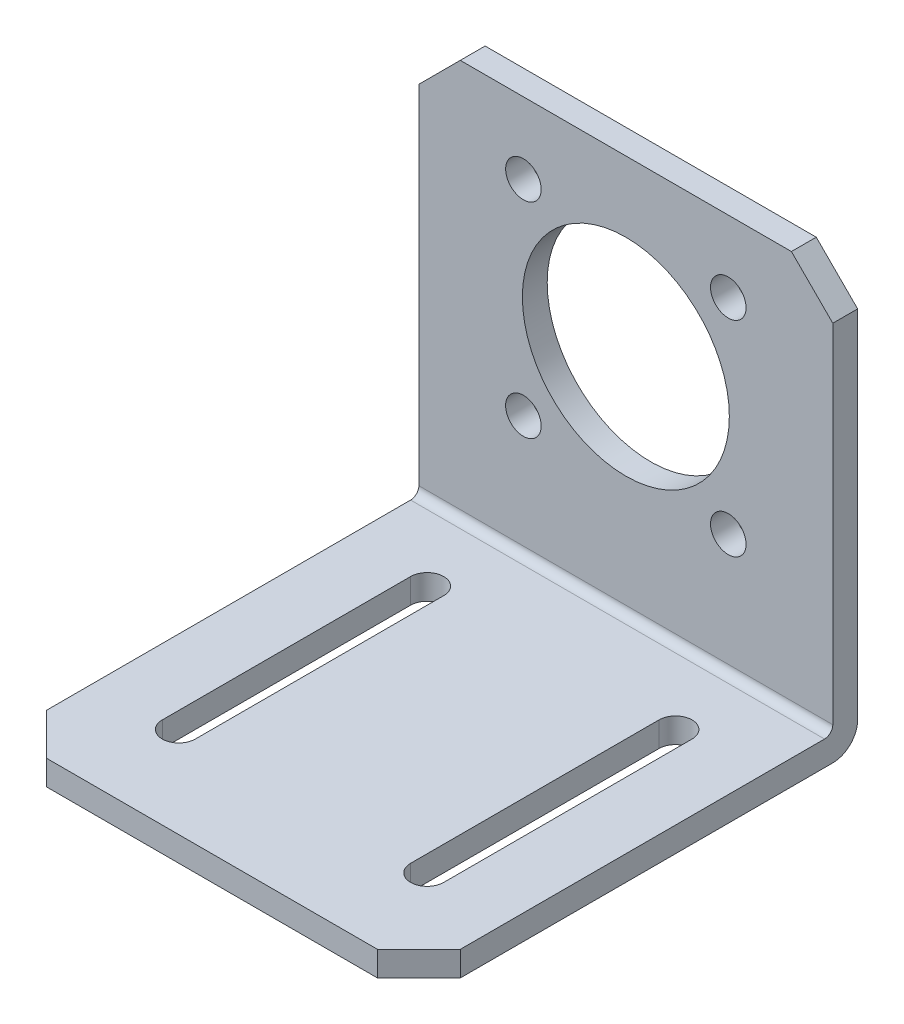
ISO-10303-21;
HEADER;
FILE_DESCRIPTION(('STEP AP214'),'2;1');
FILE_NAME('part.step','',(''),(''),'','','');
FILE_SCHEMA(('AUTOMOTIVE_DESIGN { 1 0 10303 214 1 1 1 1 }'));
ENDSEC;
DATA;
#1=APPLICATION_CONTEXT('core data for automotive mechanical design processes');
#2=APPLICATION_PROTOCOL_DEFINITION('international standard','automotive_design',2000,#1);
#3=PRODUCT_CONTEXT('',#1,'mechanical');
#4=PRODUCT('Part','Part','',(#3));
#5=PRODUCT_RELATED_PRODUCT_CATEGORY('part','',(#4));
#6=PRODUCT_DEFINITION_FORMATION('','',#4);
#7=PRODUCT_DEFINITION_CONTEXT('part definition',#1,'design');
#8=PRODUCT_DEFINITION('design','',#6,#7);
#9=PRODUCT_DEFINITION_SHAPE('','',#8);
#10=(LENGTH_UNIT() NAMED_UNIT(*) SI_UNIT(.MILLI.,.METRE.));
#11=(NAMED_UNIT(*) PLANE_ANGLE_UNIT() SI_UNIT($,.RADIAN.));
#12=(NAMED_UNIT(*) SI_UNIT($,.STERADIAN.) SOLID_ANGLE_UNIT());
#13=UNCERTAINTY_MEASURE_WITH_UNIT(LENGTH_MEASURE(1.E-05),#10,'distance_accuracy_value','');
#14=(GEOMETRIC_REPRESENTATION_CONTEXT(3) GLOBAL_UNCERTAINTY_ASSIGNED_CONTEXT((#13)) GLOBAL_UNIT_ASSIGNED_CONTEXT((#10,
#11,#12)) REPRESENTATION_CONTEXT('',''));
#15=CARTESIAN_POINT('',(0.,0.,0.));
#16=DIRECTION('',(0.,0.,1.));
#17=DIRECTION('',(1.,0.,0.));
#18=AXIS2_PLACEMENT_3D('',#15,#16,#17);
#19=CARTESIAN_POINT('',(50.,-10.3553299492386,18.5685279187817));
#20=DIRECTION('',(0.,0.,-1.));
#21=DIRECTION('',(-1.,0.,0.));
#22=AXIS2_PLACEMENT_3D('',#19,#20,#21);
#23=PLANE('',#22);
#24=DIRECTION('',(-1.,0.,0.));
#25=VECTOR('',#24,1.);
#26=CARTESIAN_POINT('',(50.,-10.3553299492386,18.5685279187817));
#27=LINE('',#26,#25);
#28=CARTESIAN_POINT('',(45.,-10.3553299492386,18.5685279187817));
#29=VERTEX_POINT('',#28);
#30=CARTESIAN_POINT('',(4.99999999999999,-10.3553299492386,18.5685279187817));
#31=VERTEX_POINT('',#30);
#32=EDGE_CURVE('E321',#29,#31,#27,.T.);
#33=ORIENTED_EDGE('',*,*,#32,.F.);
#34=DIRECTION('',(0.,1.,0.));
#35=VECTOR('',#34,1.);
#36=CARTESIAN_POINT('',(45.,-7.35532994923857,18.5685279187817));
#37=LINE('',#36,#35);
#38=CARTESIAN_POINT('',(45.,-7.35532994923857,18.5685279187817));
#39=VERTEX_POINT('',#38);
#40=EDGE_CURVE('E343',#29,#39,#37,.T.);
#41=ORIENTED_EDGE('',*,*,#40,.T.);
#42=DIRECTION('',(-1.,0.,0.));
#43=VECTOR('',#42,1.);
#44=CARTESIAN_POINT('',(50.,-7.35532994923857,18.5685279187817));
#45=LINE('',#44,#43);
#46=CARTESIAN_POINT('',(4.99999999999999,-7.35532994923857,18.5685279187817));
#47=VERTEX_POINT('',#46);
#48=EDGE_CURVE('E284',#39,#47,#45,.T.);
#49=ORIENTED_EDGE('',*,*,#48,.T.);
#50=DIRECTION('',(0.,-1.,0.));
#51=VECTOR('',#50,1.);
#52=CARTESIAN_POINT('',(4.99999999999999,-10.3553299492386,18.5685279187817));
#53=LINE('',#52,#51);
#54=EDGE_CURVE('E339',#47,#31,#53,.T.);
#55=ORIENTED_EDGE('',*,*,#54,.T.);
#56=EDGE_LOOP('',(#33,#41,#49,#55));
#57=FACE_BOUND('',#56,.T.);
#58=ADVANCED_FACE('F41',(#57),#23,.F.);
#59=CARTESIAN_POINT('',(50.,-10.3553299492386,18.5685279187817));
#60=DIRECTION('',(0.,1.,0.));
#61=DIRECTION('',(0.,0.,1.));
#62=AXIS2_PLACEMENT_3D('',#59,#60,#61);
#63=PLANE('',#62);
#64=DIRECTION('',(0.,0.,-1.));
#65=VECTOR('',#64,1.);
#66=CARTESIAN_POINT('',(8.,-10.3553299492386,7.5685279187817));
#67=LINE('',#66,#65);
#68=CARTESIAN_POINT('',(8.,-10.3553299492386,7.5685279187817));
#69=VERTEX_POINT('',#68);
#70=CARTESIAN_POINT('',(8.,-10.3553299492386,-22.4314720812183));
#71=VERTEX_POINT('',#70);
#72=EDGE_CURVE('E197',#69,#71,#67,.T.);
#73=ORIENTED_EDGE('',*,*,#72,.F.);
#74=CARTESIAN_POINT('',(10.,-10.3553299492386,7.5685279187817));
#75=DIRECTION('',(0.,-1.,0.));
#76=DIRECTION('',(0.,0.,-1.));
#77=AXIS2_PLACEMENT_3D('',#74,#75,#76);
#78=CIRCLE('',#77,2.);
#79=CARTESIAN_POINT('',(12.,-10.3553299492386,7.5685279187817));
#80=VERTEX_POINT('',#79);
#81=EDGE_CURVE('E57',#80,#69,#78,.T.);
#82=ORIENTED_EDGE('',*,*,#81,.F.);
#83=DIRECTION('',(0.,0.,1.));
#84=VECTOR('',#83,1.);
#85=CARTESIAN_POINT('',(12.,-10.3553299492386,7.5685279187817));
#86=LINE('',#85,#84);
#87=CARTESIAN_POINT('',(12.,-10.3553299492386,-22.4314720812183));
#88=VERTEX_POINT('',#87);
#89=EDGE_CURVE('E205',#88,#80,#86,.T.);
#90=ORIENTED_EDGE('',*,*,#89,.F.);
#91=CARTESIAN_POINT('',(10.,-10.3553299492386,-22.4314720812183));
#92=DIRECTION('',(0.,-1.,0.));
#93=DIRECTION('',(0.,0.,-1.));
#94=AXIS2_PLACEMENT_3D('',#91,#92,#93);
#95=CIRCLE('',#94,2.);
#96=EDGE_CURVE('E186',#71,#88,#95,.T.);
#97=ORIENTED_EDGE('',*,*,#96,.F.);
#98=EDGE_LOOP('',(#73,#82,#90,#97));
#99=FACE_BOUND('',#98,.T.);
#100=DIRECTION('',(0.,0.,-1.));
#101=VECTOR('',#100,1.);
#102=CARTESIAN_POINT('',(38.,-10.3553299492386,7.5685279187817));
#103=LINE('',#102,#101);
#104=CARTESIAN_POINT('',(38.,-10.3553299492386,7.5685279187817));
#105=VERTEX_POINT('',#104);
#106=CARTESIAN_POINT('',(38.,-10.3553299492386,-22.4314720812183));
#107=VERTEX_POINT('',#106);
#108=EDGE_CURVE('E222',#105,#107,#103,.T.);
#109=ORIENTED_EDGE('',*,*,#108,.F.);
#110=CARTESIAN_POINT('',(40.,-10.3553299492386,7.5685279187817));
#111=DIRECTION('',(0.,-1.,0.));
#112=DIRECTION('',(0.,0.,-1.));
#113=AXIS2_PLACEMENT_3D('',#110,#111,#112);
#114=CIRCLE('',#113,2.);
#115=CARTESIAN_POINT('',(42.,-10.3553299492386,7.5685279187817));
#116=VERTEX_POINT('',#115);
#117=EDGE_CURVE('E65',#116,#105,#114,.T.);
#118=ORIENTED_EDGE('',*,*,#117,.F.);
#119=DIRECTION('',(0.,0.,1.));
#120=VECTOR('',#119,1.);
#121=CARTESIAN_POINT('',(42.,-10.3553299492386,7.5685279187817));
#122=LINE('',#121,#120);
#123=CARTESIAN_POINT('',(42.,-10.3553299492386,-22.4314720812183));
#124=VERTEX_POINT('',#123);
#125=EDGE_CURVE('E230',#124,#116,#122,.T.);
#126=ORIENTED_EDGE('',*,*,#125,.F.);
#127=CARTESIAN_POINT('',(40.,-10.3553299492386,-22.4314720812183));
#128=DIRECTION('',(0.,-1.,0.));
#129=DIRECTION('',(0.,0.,-1.));
#130=AXIS2_PLACEMENT_3D('',#127,#128,#129);
#131=CIRCLE('',#130,2.);
#132=EDGE_CURVE('E226',#107,#124,#131,.T.);
#133=ORIENTED_EDGE('',*,*,#132,.F.);
#134=EDGE_LOOP('',(#109,#118,#126,#133));
#135=FACE_BOUND('',#134,.T.);
#136=DIRECTION('',(0.,0.,-1.));
#137=VECTOR('',#136,1.);
#138=CARTESIAN_POINT('',(50.,-10.3553299492386,18.5685279187817));
#139=LINE('',#138,#137);
#140=CARTESIAN_POINT('',(50.,-10.3553299492386,13.5685279187817));
#141=VERTEX_POINT('',#140);
#142=CARTESIAN_POINT('',(50.,-10.3553299492386,-31.4314720812183));
#143=VERTEX_POINT('',#142);
#144=EDGE_CURVE('E266',#141,#143,#139,.T.);
#145=ORIENTED_EDGE('',*,*,#144,.F.);
#146=DIRECTION('',(-0.707106781186549,0.,0.707106781186547));
#147=VECTOR('',#146,1.);
#148=CARTESIAN_POINT('',(50.,-10.3553299492386,13.5685279187817));
#149=LINE('',#148,#147);
#150=EDGE_CURVE('E336',#141,#29,#149,.T.);
#151=ORIENTED_EDGE('',*,*,#150,.T.);
#152=ORIENTED_EDGE('',*,*,#32,.T.);
#153=DIRECTION('',(0.707106781186547,0.,0.707106781186549));
#154=VECTOR('',#153,1.);
#155=CARTESIAN_POINT('',(4.99999999999999,-10.3553299492386,18.5685279187817));
#156=LINE('',#155,#154);
#157=CARTESIAN_POINT('',(0.,-10.3553299492386,13.5685279187817));
#158=VERTEX_POINT('',#157);
#159=EDGE_CURVE('E333',#31,#158,#156,.F.);
#160=ORIENTED_EDGE('',*,*,#159,.T.);
#161=DIRECTION('',(0.,0.,-1.));
#162=VECTOR('',#161,1.);
#163=CARTESIAN_POINT('',(0.,-10.3553299492386,18.5685279187817));
#164=LINE('',#163,#162);
#165=CARTESIAN_POINT('',(0.,-10.3553299492386,-31.4314720812183));
#166=VERTEX_POINT('',#165);
#167=EDGE_CURVE('E285',#158,#166,#164,.T.);
#168=ORIENTED_EDGE('',*,*,#167,.T.);
#169=DIRECTION('',(-1.,0.,0.));
#170=VECTOR('',#169,1.);
#171=CARTESIAN_POINT('',(50.,-10.3553299492386,-31.4314720812183));
#172=LINE('',#171,#170);
#173=EDGE_CURVE('E317',#143,#166,#172,.T.);
#174=ORIENTED_EDGE('',*,*,#173,.F.);
#175=EDGE_LOOP('',(#145,#151,#152,#160,#168,#174));
#176=FACE_BOUND('',#175,.T.);
#177=ADVANCED_FACE('F202',(#99,#135,#176),#63,.F.);
#178=CARTESIAN_POINT('',(50.,-7.35532994923857,-31.4314720812183));
#179=DIRECTION('',(-1.,0.,0.));
#180=DIRECTION('',(0.,0.,1.));
#181=AXIS2_PLACEMENT_3D('',#178,#179,#180);
#182=CYLINDRICAL_SURFACE('',#181,3.);
#183=CARTESIAN_POINT('',(0.,-7.35532994923857,-31.4314720812183));
#184=DIRECTION('',(1.,0.,0.));
#185=DIRECTION('',(0.,0.,-1.));
#186=AXIS2_PLACEMENT_3D('',#183,#184,#185);
#187=CIRCLE('',#186,3.);
#188=CARTESIAN_POINT('',(0.,-7.35532994923857,-34.4314720812183));
#189=VERTEX_POINT('',#188);
#190=EDGE_CURVE('E288',#166,#189,#187,.T.);
#191=ORIENTED_EDGE('',*,*,#190,.T.);
#192=DIRECTION('',(-1.,0.,0.));
#193=VECTOR('',#192,1.);
#194=CARTESIAN_POINT('',(50.,-7.35532994923857,-34.4314720812183));
#195=LINE('',#194,#193);
#196=CARTESIAN_POINT('',(50.,-7.35532994923857,-34.4314720812183));
#197=VERTEX_POINT('',#196);
#198=EDGE_CURVE('E313',#197,#189,#195,.T.);
#199=ORIENTED_EDGE('',*,*,#198,.F.);
#200=CARTESIAN_POINT('',(50.,-7.35532994923857,-31.4314720812183));
#201=DIRECTION('',(1.,0.,0.));
#202=DIRECTION('',(0.,0.,-1.));
#203=AXIS2_PLACEMENT_3D('',#200,#201,#202);
#204=CIRCLE('',#203,3.);
#205=EDGE_CURVE('E269',#143,#197,#204,.T.);
#206=ORIENTED_EDGE('',*,*,#205,.F.);
#207=ORIENTED_EDGE('',*,*,#173,.T.);
#208=EDGE_LOOP('',(#191,#199,#206,#207));
#209=FACE_BOUND('',#208,.T.);
#210=ADVANCED_FACE('F458',(#209),#182,.T.);
#211=CARTESIAN_POINT('',(50.,-7.35532994923855,-34.4314720812183));
#212=DIRECTION('',(0.,0.,1.));
#213=DIRECTION('',(1.,0.,0.));
#214=AXIS2_PLACEMENT_3D('',#211,#212,#213);
#215=PLANE('',#214);
#216=CARTESIAN_POINT('',(37.3743686707646,7.27030137999685,-34.4314720812183));
#217=DIRECTION('',(0.,0.,-1.));
#218=DIRECTION('',(1.,0.,0.));
#219=AXIS2_PLACEMENT_3D('',#216,#217,#218);
#220=CIRCLE('',#219,2.14780184113266);
#221=CARTESIAN_POINT('',(39.5221705118972,7.27030137999685,-34.4314720812183));
#222=VERTEX_POINT('',#221);
#223=EDGE_CURVE('E215',#222,#222,#220,.T.);
#224=ORIENTED_EDGE('',*,*,#223,.F.);
#225=EDGE_LOOP('',(#224));
#226=FACE_BOUND('',#225,.T.);
#227=CARTESIAN_POINT('',(12.6256313292354,7.27030137999685,-34.4314720812183));
#228=DIRECTION('',(0.,0.,-1.));
#229=DIRECTION('',(-1.,0.,0.));
#230=AXIS2_PLACEMENT_3D('',#227,#228,#229);
#231=CIRCLE('',#230,2.14780184113266);
#232=CARTESIAN_POINT('',(10.4778294881028,7.27030137999685,-34.4314720812183));
#233=VERTEX_POINT('',#232);
#234=EDGE_CURVE('E255',#233,#233,#231,.T.);
#235=ORIENTED_EDGE('',*,*,#234,.F.);
#236=EDGE_LOOP('',(#235));
#237=FACE_BOUND('',#236,.T.);
#238=CARTESIAN_POINT('',(12.6256313292354,32.019038721526,-34.4314720812183));
#239=DIRECTION('',(0.,0.,-1.));
#240=DIRECTION('',(1.,0.,0.));
#241=AXIS2_PLACEMENT_3D('',#238,#239,#240);
#242=CIRCLE('',#241,2.14780184113266);
#243=CARTESIAN_POINT('',(14.7734331703681,32.019038721526,-34.4314720812183));
#244=VERTEX_POINT('',#243);
#245=EDGE_CURVE('E251',#244,#244,#242,.T.);
#246=ORIENTED_EDGE('',*,*,#245,.F.);
#247=EDGE_LOOP('',(#246));
#248=FACE_BOUND('',#247,.T.);
#249=CARTESIAN_POINT('',(37.3743686707646,32.019038721526,-34.4314720812183));
#250=DIRECTION('',(0.,0.,-1.));
#251=DIRECTION('',(-1.,0.,0.));
#252=AXIS2_PLACEMENT_3D('',#249,#250,#251);
#253=CIRCLE('',#252,2.14780184113266);
#254=CARTESIAN_POINT('',(35.2265668296319,32.019038721526,-34.4314720812183));
#255=VERTEX_POINT('',#254);
#256=EDGE_CURVE('E246',#255,#255,#253,.T.);
#257=ORIENTED_EDGE('',*,*,#256,.F.);
#258=EDGE_LOOP('',(#257));
#259=FACE_BOUND('',#258,.T.);
#260=CARTESIAN_POINT('',(25.,19.6446700507614,-34.4314720812183));
#261=DIRECTION('',(0.,0.,-1.));
#262=DIRECTION('',(-1.,0.,0.));
#263=AXIS2_PLACEMENT_3D('',#260,#261,#262);
#264=CIRCLE('',#263,12.5);
#265=CARTESIAN_POINT('',(12.5,19.6446700507614,-34.4314720812183));
#266=VERTEX_POINT('',#265);
#267=EDGE_CURVE('E250',#266,#266,#264,.T.);
#268=ORIENTED_EDGE('',*,*,#267,.F.);
#269=EDGE_LOOP('',(#268));
#270=FACE_BOUND('',#269,.T.);
#271=DIRECTION('',(0.,1.,0.));
#272=VECTOR('',#271,1.);
#273=CARTESIAN_POINT('',(0.,-7.35532994923855,-34.4314720812183));
#274=LINE('',#273,#272);
#275=CARTESIAN_POINT('',(0.,35.6446700507614,-34.4314720812183));
#276=VERTEX_POINT('',#275);
#277=EDGE_CURVE('E292',#189,#276,#274,.T.);
#278=ORIENTED_EDGE('',*,*,#277,.T.);
#279=DIRECTION('',(-0.707106781186547,-0.707106781186548,0.));
#280=VECTOR('',#279,1.);
#281=CARTESIAN_POINT('',(4.99999999999999,40.6446700507614,-34.4314720812183));
#282=LINE('',#281,#280);
#283=CARTESIAN_POINT('',(4.99999999999999,40.6446700507614,-34.4314720812183));
#284=VERTEX_POINT('',#283);
#285=EDGE_CURVE('E376',#276,#284,#282,.F.);
#286=ORIENTED_EDGE('',*,*,#285,.T.);
#287=DIRECTION('',(-1.,0.,0.));
#288=VECTOR('',#287,1.);
#289=CARTESIAN_POINT('',(50.,40.6446700507614,-34.4314720812183));
#290=LINE('',#289,#288);
#291=CARTESIAN_POINT('',(45.,40.6446700507614,-34.4314720812183));
#292=VERTEX_POINT('',#291);
#293=EDGE_CURVE('E309',#292,#284,#290,.T.);
#294=ORIENTED_EDGE('',*,*,#293,.F.);
#295=DIRECTION('',(0.707106781186549,-0.707106781186546,0.));
#296=VECTOR('',#295,1.);
#297=CARTESIAN_POINT('',(50.,35.6446700507614,-34.4314720812183));
#298=LINE('',#297,#296);
#299=CARTESIAN_POINT('',(50.,35.6446700507614,-34.4314720812183));
#300=VERTEX_POINT('',#299);
#301=EDGE_CURVE('E373',#292,#300,#298,.T.);
#302=ORIENTED_EDGE('',*,*,#301,.T.);
#303=DIRECTION('',(0.,1.,0.));
#304=VECTOR('',#303,1.);
#305=CARTESIAN_POINT('',(50.,-7.35532994923855,-34.4314720812183));
#306=LINE('',#305,#304);
#307=EDGE_CURVE('E273',#197,#300,#306,.T.);
#308=ORIENTED_EDGE('',*,*,#307,.F.);
#309=ORIENTED_EDGE('',*,*,#198,.T.);
#310=EDGE_LOOP('',(#278,#286,#294,#302,#308,#309));
#311=FACE_BOUND('',#310,.T.);
#312=ADVANCED_FACE('F501',(#226,#237,#248,#259,#270,#311),#215,.F.);
#313=CARTESIAN_POINT('',(50.,40.6446700507614,-34.4314720812183));
#314=DIRECTION('',(0.,-1.,0.));
#315=DIRECTION('',(0.,0.,-1.));
#316=AXIS2_PLACEMENT_3D('',#313,#314,#315);
#317=PLANE('',#316);
#318=ORIENTED_EDGE('',*,*,#293,.T.);
#319=DIRECTION('',(0.,0.,1.));
#320=VECTOR('',#319,1.);
#321=CARTESIAN_POINT('',(4.99999999999999,40.6446700507614,-34.4314720812183));
#322=LINE('',#321,#320);
#323=CARTESIAN_POINT('',(4.99999999999999,40.6446700507614,-31.4314720812183));
#324=VERTEX_POINT('',#323);
#325=EDGE_CURVE('E363',#284,#324,#322,.T.);
#326=ORIENTED_EDGE('',*,*,#325,.T.);
#327=DIRECTION('',(-1.,0.,0.));
#328=VECTOR('',#327,1.);
#329=CARTESIAN_POINT('',(50.,40.6446700507614,-31.4314720812183));
#330=LINE('',#329,#328);
#331=CARTESIAN_POINT('',(45.,40.6446700507614,-31.4314720812183));
#332=VERTEX_POINT('',#331);
#333=EDGE_CURVE('E305',#332,#324,#330,.T.);
#334=ORIENTED_EDGE('',*,*,#333,.F.);
#335=DIRECTION('',(0.,0.,-1.));
#336=VECTOR('',#335,1.);
#337=CARTESIAN_POINT('',(45.,40.6446700507614,-34.4314720812183));
#338=LINE('',#337,#336);
#339=EDGE_CURVE('E360',#332,#292,#338,.T.);
#340=ORIENTED_EDGE('',*,*,#339,.T.);
#341=EDGE_LOOP('',(#318,#326,#334,#340));
#342=FACE_BOUND('',#341,.T.);
#343=ADVANCED_FACE('F519',(#342),#317,.F.);
#344=CARTESIAN_POINT('',(50.,-7.35532994923857,-31.4314720812183));
#345=DIRECTION('',(0.,0.,-1.));
#346=DIRECTION('',(0.,1.,0.));
#347=AXIS2_PLACEMENT_3D('',#344,#345,#346);
#348=PLANE('',#347);
#349=CARTESIAN_POINT('',(37.3743686707646,7.27030137999685,-31.4314720812183));
#350=DIRECTION('',(0.,0.,-1.));
#351=DIRECTION('',(0.,1.,0.));
#352=AXIS2_PLACEMENT_3D('',#349,#350,#351);
#353=CIRCLE('',#352,2.14780184113266);
#354=CARTESIAN_POINT('',(37.3743686707646,9.41810322112952,-31.4314720812183));
#355=VERTEX_POINT('',#354);
#356=EDGE_CURVE('E289',#355,#355,#353,.T.);
#357=ORIENTED_EDGE('',*,*,#356,.T.);
#358=EDGE_LOOP('',(#357));
#359=FACE_BOUND('',#358,.T.);
#360=CARTESIAN_POINT('',(12.6256313292354,7.27030137999685,-31.4314720812183));
#361=DIRECTION('',(0.,0.,-1.));
#362=DIRECTION('',(0.,1.,0.));
#363=AXIS2_PLACEMENT_3D('',#360,#361,#362);
#364=CIRCLE('',#363,2.14780184113266);
#365=CARTESIAN_POINT('',(12.6256313292354,9.41810322112952,-31.4314720812183));
#366=VERTEX_POINT('',#365);
#367=EDGE_CURVE('E404',#366,#366,#364,.T.);
#368=ORIENTED_EDGE('',*,*,#367,.T.);
#369=EDGE_LOOP('',(#368));
#370=FACE_BOUND('',#369,.T.);
#371=CARTESIAN_POINT('',(12.6256313292354,32.019038721526,-31.4314720812183));
#372=DIRECTION('',(0.,0.,-1.));
#373=DIRECTION('',(0.,1.,0.));
#374=AXIS2_PLACEMENT_3D('',#371,#372,#373);
#375=CIRCLE('',#374,2.14780184113266);
#376=CARTESIAN_POINT('',(12.6256313292354,34.1668405626587,-31.4314720812183));
#377=VERTEX_POINT('',#376);
#378=EDGE_CURVE('E400',#377,#377,#375,.T.);
#379=ORIENTED_EDGE('',*,*,#378,.T.);
#380=EDGE_LOOP('',(#379));
#381=FACE_BOUND('',#380,.T.);
#382=CARTESIAN_POINT('',(37.3743686707646,32.019038721526,-31.4314720812183));
#383=DIRECTION('',(0.,0.,-1.));
#384=DIRECTION('',(0.,1.,0.));
#385=AXIS2_PLACEMENT_3D('',#382,#383,#384);
#386=CIRCLE('',#385,2.14780184113266);
#387=CARTESIAN_POINT('',(37.3743686707646,34.1668405626587,-31.4314720812183));
#388=VERTEX_POINT('',#387);
#389=EDGE_CURVE('E396',#388,#388,#386,.T.);
#390=ORIENTED_EDGE('',*,*,#389,.T.);
#391=EDGE_LOOP('',(#390));
#392=FACE_BOUND('',#391,.T.);
#393=CARTESIAN_POINT('',(25.,19.6446700507614,-31.4314720812183));
#394=DIRECTION('',(0.,0.,-1.));
#395=DIRECTION('',(0.,1.,0.));
#396=AXIS2_PLACEMENT_3D('',#393,#394,#395);
#397=CIRCLE('',#396,12.5);
#398=CARTESIAN_POINT('',(25.,32.1446700507614,-31.4314720812183));
#399=VERTEX_POINT('',#398);
#400=EDGE_CURVE('E265',#399,#399,#397,.T.);
#401=ORIENTED_EDGE('',*,*,#400,.T.);
#402=EDGE_LOOP('',(#401));
#403=FACE_BOUND('',#402,.T.);
#404=DIRECTION('',(0.,-1.,0.));
#405=VECTOR('',#404,1.);
#406=CARTESIAN_POINT('',(0.,-7.35532994923857,-31.4314720812183));
#407=LINE('',#406,#405);
#408=CARTESIAN_POINT('',(0.,35.6446700507614,-31.4314720812183));
#409=VERTEX_POINT('',#408);
#410=CARTESIAN_POINT('',(0.,-6.35532994923857,-31.4314720812183));
#411=VERTEX_POINT('',#410);
#412=EDGE_CURVE('E296',#409,#411,#407,.T.);
#413=ORIENTED_EDGE('',*,*,#412,.T.);
#414=DIRECTION('',(-1.,0.,0.));
#415=VECTOR('',#414,1.);
#416=CARTESIAN_POINT('',(50.,-6.35532994923857,-31.4314720812183));
#417=LINE('',#416,#415);
#418=CARTESIAN_POINT('',(50.,-6.35532994923857,-31.4314720812183));
#419=VERTEX_POINT('',#418);
#420=EDGE_CURVE('E383',#411,#419,#417,.F.);
#421=ORIENTED_EDGE('',*,*,#420,.T.);
#422=DIRECTION('',(0.,-1.,0.));
#423=VECTOR('',#422,1.);
#424=CARTESIAN_POINT('',(50.,-7.35532994923857,-31.4314720812183));
#425=LINE('',#424,#423);
#426=CARTESIAN_POINT('',(50.,35.6446700507614,-31.4314720812183));
#427=VERTEX_POINT('',#426);
#428=EDGE_CURVE('E277',#427,#419,#425,.T.);
#429=ORIENTED_EDGE('',*,*,#428,.F.);
#430=DIRECTION('',(-0.707106781186549,0.707106781186546,0.));
#431=VECTOR('',#430,1.);
#432=CARTESIAN_POINT('',(50.,35.6446700507614,-31.4314720812184));
#433=LINE('',#432,#431);
#434=EDGE_CURVE('E367',#427,#332,#433,.T.);
#435=ORIENTED_EDGE('',*,*,#434,.T.);
#436=ORIENTED_EDGE('',*,*,#333,.T.);
#437=DIRECTION('',(0.707106781186547,0.707106781186548,0.));
#438=VECTOR('',#437,1.);
#439=CARTESIAN_POINT('',(4.99999999999999,40.6446700507614,-31.4314720812183));
#440=LINE('',#439,#438);
#441=EDGE_CURVE('E370',#324,#409,#440,.F.);
#442=ORIENTED_EDGE('',*,*,#441,.T.);
#443=EDGE_LOOP('',(#413,#421,#429,#435,#436,#442));
#444=FACE_BOUND('',#443,.T.);
#445=ADVANCED_FACE('F522',(#359,#370,#381,#392,#403,#444),#348,.F.);
#446=CARTESIAN_POINT('',(50.,-7.35532994923857,18.5685279187817));
#447=DIRECTION('',(0.,-1.,0.));
#448=DIRECTION('',(0.,0.,-1.));
#449=AXIS2_PLACEMENT_3D('',#446,#447,#448);
#450=PLANE('',#449);
#451=DIRECTION('',(0.,0.,1.));
#452=VECTOR('',#451,1.);
#453=CARTESIAN_POINT('',(12.,-7.35532994923857,18.5685279187817));
#454=LINE('',#453,#452);
#455=CARTESIAN_POINT('',(12.,-7.35532994923857,-22.4314720812183));
#456=VERTEX_POINT('',#455);
#457=CARTESIAN_POINT('',(12.,-7.35532994923857,7.5685279187817));
#458=VERTEX_POINT('',#457);
#459=EDGE_CURVE('E50',#456,#458,#454,.T.);
#460=ORIENTED_EDGE('',*,*,#459,.T.);
#461=CARTESIAN_POINT('',(10.,-7.35532994923857,7.5685279187817));
#462=DIRECTION('',(0.,-1.,0.));
#463=DIRECTION('',(0.,0.,-1.));
#464=AXIS2_PLACEMENT_3D('',#461,#462,#463);
#465=CIRCLE('',#464,2.);
#466=CARTESIAN_POINT('',(8.,-7.35532994923857,7.5685279187817));
#467=VERTEX_POINT('',#466);
#468=EDGE_CURVE('E11',#458,#467,#465,.T.);
#469=ORIENTED_EDGE('',*,*,#468,.T.);
#470=DIRECTION('',(0.,0.,-1.));
#471=VECTOR('',#470,1.);
#472=CARTESIAN_POINT('',(8.,-7.35532994923857,18.5685279187817));
#473=LINE('',#472,#471);
#474=CARTESIAN_POINT('',(8.,-7.35532994923857,-22.4314720812183));
#475=VERTEX_POINT('',#474);
#476=EDGE_CURVE('E426',#467,#475,#473,.T.);
#477=ORIENTED_EDGE('',*,*,#476,.T.);
#478=CARTESIAN_POINT('',(10.,-7.35532994923857,-22.4314720812183));
#479=DIRECTION('',(0.,-1.,0.));
#480=DIRECTION('',(0.,0.,-1.));
#481=AXIS2_PLACEMENT_3D('',#478,#479,#480);
#482=CIRCLE('',#481,2.);
#483=EDGE_CURVE('E189',#475,#456,#482,.T.);
#484=ORIENTED_EDGE('',*,*,#483,.T.);
#485=EDGE_LOOP('',(#460,#469,#477,#484));
#486=FACE_BOUND('',#485,.T.);
#487=DIRECTION('',(0.,0.,1.));
#488=VECTOR('',#487,1.);
#489=CARTESIAN_POINT('',(42.,-7.35532994923857,18.5685279187817));
#490=LINE('',#489,#488);
#491=CARTESIAN_POINT('',(42.,-7.35532994923857,-22.4314720812183));
#492=VERTEX_POINT('',#491);
#493=CARTESIAN_POINT('',(42.,-7.35532994923857,7.5685279187817));
#494=VERTEX_POINT('',#493);
#495=EDGE_CURVE('E418',#492,#494,#490,.T.);
#496=ORIENTED_EDGE('',*,*,#495,.T.);
#497=CARTESIAN_POINT('',(40.,-7.35532994923857,7.5685279187817));
#498=DIRECTION('',(0.,-1.,0.));
#499=DIRECTION('',(0.,0.,-1.));
#500=AXIS2_PLACEMENT_3D('',#497,#498,#499);
#501=CIRCLE('',#500,2.);
#502=CARTESIAN_POINT('',(38.,-7.35532994923857,7.5685279187817));
#503=VERTEX_POINT('',#502);
#504=EDGE_CURVE('E422',#494,#503,#501,.T.);
#505=ORIENTED_EDGE('',*,*,#504,.T.);
#506=DIRECTION('',(0.,0.,-1.));
#507=VECTOR('',#506,1.);
#508=CARTESIAN_POINT('',(38.,-7.35532994923857,18.5685279187817));
#509=LINE('',#508,#507);
#510=CARTESIAN_POINT('',(38.,-7.35532994923857,-22.4314720812183));
#511=VERTEX_POINT('',#510);
#512=EDGE_CURVE('E392',#503,#511,#509,.T.);
#513=ORIENTED_EDGE('',*,*,#512,.T.);
#514=CARTESIAN_POINT('',(40.,-7.35532994923857,-22.4314720812183));
#515=DIRECTION('',(0.,-1.,0.));
#516=DIRECTION('',(0.,0.,-1.));
#517=AXIS2_PLACEMENT_3D('',#514,#515,#516);
#518=CIRCLE('',#517,2.);
#519=EDGE_CURVE('E414',#511,#492,#518,.T.);
#520=ORIENTED_EDGE('',*,*,#519,.T.);
#521=EDGE_LOOP('',(#496,#505,#513,#520));
#522=FACE_BOUND('',#521,.T.);
#523=DIRECTION('',(0.,0.,1.));
#524=VECTOR('',#523,1.);
#525=CARTESIAN_POINT('',(50.,-7.35532994923857,18.5685279187817));
#526=LINE('',#525,#524);
#527=CARTESIAN_POINT('',(50.,-7.35532994923857,-30.4314720812183));
#528=VERTEX_POINT('',#527);
#529=CARTESIAN_POINT('',(50.,-7.35532994923857,13.5685279187817));
#530=VERTEX_POINT('',#529);
#531=EDGE_CURVE('E281',#528,#530,#526,.T.);
#532=ORIENTED_EDGE('',*,*,#531,.F.);
#533=DIRECTION('',(-1.,0.,0.));
#534=VECTOR('',#533,1.);
#535=CARTESIAN_POINT('',(0.,-7.35532994923857,-30.4314720812183));
#536=LINE('',#535,#534);
#537=CARTESIAN_POINT('',(0.,-7.35532994923857,-30.4314720812183));
#538=VERTEX_POINT('',#537);
#539=EDGE_CURVE('E379',#528,#538,#536,.T.);
#540=ORIENTED_EDGE('',*,*,#539,.T.);
#541=DIRECTION('',(0.,0.,1.));
#542=VECTOR('',#541,1.);
#543=CARTESIAN_POINT('',(0.,-7.35532994923857,18.5685279187817));
#544=LINE('',#543,#542);
#545=CARTESIAN_POINT('',(0.,-7.35532994923857,13.5685279187817));
#546=VERTEX_POINT('',#545);
#547=EDGE_CURVE('E270',#538,#546,#544,.T.);
#548=ORIENTED_EDGE('',*,*,#547,.T.);
#549=DIRECTION('',(-0.707106781186547,0.,-0.707106781186549));
#550=VECTOR('',#549,1.);
#551=CARTESIAN_POINT('',(4.99999999999999,-7.35532994923857,18.5685279187817));
#552=LINE('',#551,#550);
#553=EDGE_CURVE('E346',#546,#47,#552,.F.);
#554=ORIENTED_EDGE('',*,*,#553,.T.);
#555=ORIENTED_EDGE('',*,*,#48,.F.);
#556=DIRECTION('',(0.707106781186549,0.,-0.707106781186547));
#557=VECTOR('',#556,1.);
#558=CARTESIAN_POINT('',(50.,-7.35532994923857,13.5685279187817));
#559=LINE('',#558,#557);
#560=EDGE_CURVE('E349',#39,#530,#559,.T.);
#561=ORIENTED_EDGE('',*,*,#560,.T.);
#562=EDGE_LOOP('',(#532,#540,#548,#554,#555,#561));
#563=FACE_BOUND('',#562,.T.);
#564=ADVANCED_FACE('F433',(#486,#522,#563),#450,.F.);
#565=CARTESIAN_POINT('',(50.,-7.35532994923857,-31.4314720812183));
#566=DIRECTION('',(1.,0.,0.));
#567=DIRECTION('',(0.,0.,-1.));
#568=AXIS2_PLACEMENT_3D('',#565,#566,#567);
#569=PLANE('',#568);
#570=ORIENTED_EDGE('',*,*,#428,.T.);
#571=CARTESIAN_POINT('',(50.,-6.35532994923857,-30.4314720812183));
#572=DIRECTION('',(1.,0.,0.));
#573=DIRECTION('',(0.,0.,-1.));
#574=AXIS2_PLACEMENT_3D('',#571,#572,#573);
#575=CIRCLE('',#574,1.);
#576=EDGE_CURVE('E389',#419,#528,#575,.F.);
#577=ORIENTED_EDGE('',*,*,#576,.T.);
#578=ORIENTED_EDGE('',*,*,#531,.T.);
#579=DIRECTION('',(0.,-1.,0.));
#580=VECTOR('',#579,1.);
#581=CARTESIAN_POINT('',(50.,-10.3553299492386,13.5685279187817));
#582=LINE('',#581,#580);
#583=EDGE_CURVE('E329',#530,#141,#582,.T.);
#584=ORIENTED_EDGE('',*,*,#583,.T.);
#585=ORIENTED_EDGE('',*,*,#144,.T.);
#586=ORIENTED_EDGE('',*,*,#205,.T.);
#587=ORIENTED_EDGE('',*,*,#307,.T.);
#588=DIRECTION('',(0.,0.,1.));
#589=VECTOR('',#588,1.);
#590=CARTESIAN_POINT('',(50.,35.6446700507614,-31.4314720812183));
#591=LINE('',#590,#589);
#592=EDGE_CURVE('E325',#300,#427,#591,.T.);
#593=ORIENTED_EDGE('',*,*,#592,.T.);
#594=EDGE_LOOP('',(#570,#577,#578,#584,#585,#586,#587,#593));
#595=FACE_BOUND('',#594,.T.);
#596=ADVANCED_FACE('F503',(#595),#569,.T.);
#597=CARTESIAN_POINT('',(0.,-7.35532994923857,-31.4314720812183));
#598=DIRECTION('',(1.,0.,0.));
#599=DIRECTION('',(0.,0.,-1.));
#600=AXIS2_PLACEMENT_3D('',#597,#598,#599);
#601=PLANE('',#600);
#602=ORIENTED_EDGE('',*,*,#167,.F.);
#603=DIRECTION('',(0.,1.,0.));
#604=VECTOR('',#603,1.);
#605=CARTESIAN_POINT('',(0.,-7.35532994923857,13.5685279187817));
#606=LINE('',#605,#604);
#607=EDGE_CURVE('E356',#158,#546,#606,.T.);
#608=ORIENTED_EDGE('',*,*,#607,.T.);
#609=ORIENTED_EDGE('',*,*,#547,.F.);
#610=CARTESIAN_POINT('',(0.,-6.35532994923857,-30.4314720812183));
#611=DIRECTION('',(1.,0.,0.));
#612=DIRECTION('',(0.,0.,-1.));
#613=AXIS2_PLACEMENT_3D('',#610,#611,#612);
#614=CIRCLE('',#613,1.);
#615=EDGE_CURVE('E386',#538,#411,#614,.T.);
#616=ORIENTED_EDGE('',*,*,#615,.T.);
#617=ORIENTED_EDGE('',*,*,#412,.F.);
#618=DIRECTION('',(0.,0.,-1.));
#619=VECTOR('',#618,1.);
#620=CARTESIAN_POINT('',(0.,35.6446700507614,-31.4314720812184));
#621=LINE('',#620,#619);
#622=EDGE_CURVE('E353',#409,#276,#621,.T.);
#623=ORIENTED_EDGE('',*,*,#622,.T.);
#624=ORIENTED_EDGE('',*,*,#277,.F.);
#625=ORIENTED_EDGE('',*,*,#190,.F.);
#626=EDGE_LOOP('',(#602,#608,#609,#616,#617,#623,#624,#625));
#627=FACE_BOUND('',#626,.T.);
#628=ADVANCED_FACE('F471',(#627),#601,.F.);
#629=CARTESIAN_POINT('',(50.,-7.35532994923857,13.5685279187817));
#630=DIRECTION('',(0.707106781186546,0.,0.707106781186548));
#631=DIRECTION('',(0.,1.,0.));
#632=AXIS2_PLACEMENT_3D('',#629,#630,#631);
#633=PLANE('',#632);
#634=ORIENTED_EDGE('',*,*,#560,.F.);
#635=ORIENTED_EDGE('',*,*,#40,.F.);
#636=ORIENTED_EDGE('',*,*,#150,.F.);
#637=ORIENTED_EDGE('',*,*,#583,.F.);
#638=EDGE_LOOP('',(#634,#635,#636,#637));
#639=FACE_BOUND('',#638,.T.);
#640=ADVANCED_FACE('F464',(#639),#633,.T.);
#641=CARTESIAN_POINT('',(4.99999999999999,-10.3553299492386,18.5685279187817));
#642=DIRECTION('',(0.707106781186548,0.,-0.707106781186546));
#643=DIRECTION('',(0.,-1.,0.));
#644=AXIS2_PLACEMENT_3D('',#641,#642,#643);
#645=PLANE('',#644);
#646=ORIENTED_EDGE('',*,*,#553,.F.);
#647=ORIENTED_EDGE('',*,*,#607,.F.);
#648=ORIENTED_EDGE('',*,*,#159,.F.);
#649=ORIENTED_EDGE('',*,*,#54,.F.);
#650=EDGE_LOOP('',(#646,#647,#648,#649));
#651=FACE_BOUND('',#650,.T.);
#652=ADVANCED_FACE('F470',(#651),#645,.F.);
#653=CARTESIAN_POINT('',(4.99999999999999,40.6446700507614,-34.4314720812183));
#654=DIRECTION('',(0.707106781186548,-0.707106781186547,0.));
#655=DIRECTION('',(0.,0.,1.));
#656=AXIS2_PLACEMENT_3D('',#653,#654,#655);
#657=PLANE('',#656);
#658=ORIENTED_EDGE('',*,*,#285,.F.);
#659=ORIENTED_EDGE('',*,*,#622,.F.);
#660=ORIENTED_EDGE('',*,*,#441,.F.);
#661=ORIENTED_EDGE('',*,*,#325,.F.);
#662=EDGE_LOOP('',(#658,#659,#660,#661));
#663=FACE_BOUND('',#662,.T.);
#664=ADVANCED_FACE('F478',(#663),#657,.F.);
#665=CARTESIAN_POINT('',(50.,35.6446700507614,-31.4314720812184));
#666=DIRECTION('',(0.707106781186546,0.707106781186549,0.));
#667=DIRECTION('',(0.,0.,-1.));
#668=AXIS2_PLACEMENT_3D('',#665,#666,#667);
#669=PLANE('',#668);
#670=ORIENTED_EDGE('',*,*,#301,.F.);
#671=ORIENTED_EDGE('',*,*,#339,.F.);
#672=ORIENTED_EDGE('',*,*,#434,.F.);
#673=ORIENTED_EDGE('',*,*,#592,.F.);
#674=EDGE_LOOP('',(#670,#671,#672,#673));
#675=FACE_BOUND('',#674,.T.);
#676=ADVANCED_FACE('F484',(#675),#669,.T.);
#677=CARTESIAN_POINT('',(50.,-6.35532994923857,-30.4314720812183));
#678=DIRECTION('',(1.,0.,0.));
#679=DIRECTION('',(0.,0.,-1.));
#680=AXIS2_PLACEMENT_3D('',#677,#678,#679);
#681=CYLINDRICAL_SURFACE('',#680,1.);
#682=ORIENTED_EDGE('',*,*,#576,.F.);
#683=ORIENTED_EDGE('',*,*,#420,.F.);
#684=ORIENTED_EDGE('',*,*,#615,.F.);
#685=ORIENTED_EDGE('',*,*,#539,.F.);
#686=EDGE_LOOP('',(#682,#683,#684,#685));
#687=FACE_BOUND('',#686,.T.);
#688=ADVANCED_FACE('F43',(#687),#681,.F.);
#689=CARTESIAN_POINT('',(25.,19.6446700507614,18.5685279187817));
#690=DIRECTION('',(0.,0.,-1.));
#691=DIRECTION('',(-1.,0.,0.));
#692=AXIS2_PLACEMENT_3D('',#689,#690,#691);
#693=CYLINDRICAL_SURFACE('',#692,12.5);
#694=ORIENTED_EDGE('',*,*,#267,.T.);
#695=EDGE_LOOP('',(#694));
#696=FACE_BOUND('',#695,.T.);
#697=ORIENTED_EDGE('',*,*,#400,.F.);
#698=EDGE_LOOP('',(#697));
#699=FACE_BOUND('',#698,.T.);
#700=ADVANCED_FACE('F493',(#696,#699),#693,.F.);
#701=CARTESIAN_POINT('',(37.3743686707646,32.019038721526,18.5685279187817));
#702=DIRECTION('',(0.,0.,-1.));
#703=DIRECTION('',(-1.,0.,0.));
#704=AXIS2_PLACEMENT_3D('',#701,#702,#703);
#705=CYLINDRICAL_SURFACE('',#704,2.14780184113266);
#706=ORIENTED_EDGE('',*,*,#256,.T.);
#707=EDGE_LOOP('',(#706));
#708=FACE_BOUND('',#707,.T.);
#709=ORIENTED_EDGE('',*,*,#389,.F.);
#710=EDGE_LOOP('',(#709));
#711=FACE_BOUND('',#710,.T.);
#712=ADVANCED_FACE('F581',(#708,#711),#705,.F.);
#713=CARTESIAN_POINT('',(12.6256313292354,32.019038721526,18.5685279187817));
#714=DIRECTION('',(0.,0.,-1.));
#715=DIRECTION('',(-1.,0.,0.));
#716=AXIS2_PLACEMENT_3D('',#713,#714,#715);
#717=CYLINDRICAL_SURFACE('',#716,2.14780184113266);
#718=ORIENTED_EDGE('',*,*,#245,.T.);
#719=EDGE_LOOP('',(#718));
#720=FACE_BOUND('',#719,.T.);
#721=ORIENTED_EDGE('',*,*,#378,.F.);
#722=EDGE_LOOP('',(#721));
#723=FACE_BOUND('',#722,.T.);
#724=ADVANCED_FACE('F592',(#720,#723),#717,.F.);
#725=CARTESIAN_POINT('',(12.6256313292354,7.27030137999685,18.5685279187817));
#726=DIRECTION('',(0.,0.,-1.));
#727=DIRECTION('',(-1.,0.,0.));
#728=AXIS2_PLACEMENT_3D('',#725,#726,#727);
#729=CYLINDRICAL_SURFACE('',#728,2.14780184113266);
#730=ORIENTED_EDGE('',*,*,#234,.T.);
#731=EDGE_LOOP('',(#730));
#732=FACE_BOUND('',#731,.T.);
#733=ORIENTED_EDGE('',*,*,#367,.F.);
#734=EDGE_LOOP('',(#733));
#735=FACE_BOUND('',#734,.T.);
#736=ADVANCED_FACE('F602',(#732,#735),#729,.F.);
#737=CARTESIAN_POINT('',(37.3743686707646,7.27030137999685,18.5685279187817));
#738=DIRECTION('',(0.,0.,-1.));
#739=DIRECTION('',(-1.,0.,0.));
#740=AXIS2_PLACEMENT_3D('',#737,#738,#739);
#741=CYLINDRICAL_SURFACE('',#740,2.14780184113266);
#742=ORIENTED_EDGE('',*,*,#223,.T.);
#743=EDGE_LOOP('',(#742));
#744=FACE_BOUND('',#743,.T.);
#745=ORIENTED_EDGE('',*,*,#356,.F.);
#746=EDGE_LOOP('',(#745));
#747=FACE_BOUND('',#746,.T.);
#748=ADVANCED_FACE('F612',(#744,#747),#741,.F.);
#749=CARTESIAN_POINT('',(40.,40.6446700507614,7.5685279187817));
#750=DIRECTION('',(0.,-1.,0.));
#751=DIRECTION('',(0.,0.,-1.));
#752=AXIS2_PLACEMENT_3D('',#749,#750,#751);
#753=CYLINDRICAL_SURFACE('',#752,2.);
#754=DIRECTION('',(0.,-1.,0.));
#755=VECTOR('',#754,1.);
#756=CARTESIAN_POINT('',(42.,40.6446700507614,7.5685279187817));
#757=LINE('',#756,#755);
#758=EDGE_CURVE('E235',#494,#116,#757,.T.);
#759=ORIENTED_EDGE('',*,*,#758,.T.);
#760=ORIENTED_EDGE('',*,*,#117,.T.);
#761=DIRECTION('',(0.,-1.,0.));
#762=VECTOR('',#761,1.);
#763=CARTESIAN_POINT('',(38.,40.6446700507614,7.5685279187817));
#764=LINE('',#763,#762);
#765=EDGE_CURVE('E234',#503,#105,#764,.T.);
#766=ORIENTED_EDGE('',*,*,#765,.F.);
#767=ORIENTED_EDGE('',*,*,#504,.F.);
#768=EDGE_LOOP('',(#759,#760,#766,#767));
#769=FACE_BOUND('',#768,.T.);
#770=ADVANCED_FACE('F621',(#769),#753,.F.);
#771=CARTESIAN_POINT('',(42.,40.6446700507614,7.5685279187817));
#772=DIRECTION('',(1.,0.,0.));
#773=DIRECTION('',(0.,0.,-1.));
#774=AXIS2_PLACEMENT_3D('',#771,#772,#773);
#775=PLANE('',#774);
#776=DIRECTION('',(0.,-1.,0.));
#777=VECTOR('',#776,1.);
#778=CARTESIAN_POINT('',(42.,40.6446700507614,-22.4314720812183));
#779=LINE('',#778,#777);
#780=EDGE_CURVE('E238',#492,#124,#779,.T.);
#781=ORIENTED_EDGE('',*,*,#780,.T.);
#782=ORIENTED_EDGE('',*,*,#125,.T.);
#783=ORIENTED_EDGE('',*,*,#758,.F.);
#784=ORIENTED_EDGE('',*,*,#495,.F.);
#785=EDGE_LOOP('',(#781,#782,#783,#784));
#786=FACE_BOUND('',#785,.T.);
#787=ADVANCED_FACE('F641',(#786),#775,.F.);
#788=CARTESIAN_POINT('',(40.,40.6446700507614,-22.4314720812183));
#789=DIRECTION('',(0.,-1.,0.));
#790=DIRECTION('',(0.,0.,-1.));
#791=AXIS2_PLACEMENT_3D('',#788,#789,#790);
#792=CYLINDRICAL_SURFACE('',#791,2.);
#793=DIRECTION('',(0.,-1.,0.));
#794=VECTOR('',#793,1.);
#795=CARTESIAN_POINT('',(38.,40.6446700507614,-22.4314720812183));
#796=LINE('',#795,#794);
#797=EDGE_CURVE('E241',#511,#107,#796,.T.);
#798=ORIENTED_EDGE('',*,*,#797,.T.);
#799=ORIENTED_EDGE('',*,*,#132,.T.);
#800=ORIENTED_EDGE('',*,*,#780,.F.);
#801=ORIENTED_EDGE('',*,*,#519,.F.);
#802=EDGE_LOOP('',(#798,#799,#800,#801));
#803=FACE_BOUND('',#802,.T.);
#804=ADVANCED_FACE('F447',(#803),#792,.F.);
#805=CARTESIAN_POINT('',(38.,40.6446700507614,7.5685279187817));
#806=DIRECTION('',(-1.,0.,0.));
#807=DIRECTION('',(0.,0.,1.));
#808=AXIS2_PLACEMENT_3D('',#805,#806,#807);
#809=PLANE('',#808);
#810=ORIENTED_EDGE('',*,*,#765,.T.);
#811=ORIENTED_EDGE('',*,*,#108,.T.);
#812=ORIENTED_EDGE('',*,*,#797,.F.);
#813=ORIENTED_EDGE('',*,*,#512,.F.);
#814=EDGE_LOOP('',(#810,#811,#812,#813));
#815=FACE_BOUND('',#814,.T.);
#816=ADVANCED_FACE('F440',(#815),#809,.F.);
#817=CARTESIAN_POINT('',(10.,40.6446700507614,7.5685279187817));
#818=DIRECTION('',(0.,-1.,0.));
#819=DIRECTION('',(0.,0.,-1.));
#820=AXIS2_PLACEMENT_3D('',#817,#818,#819);
#821=CYLINDRICAL_SURFACE('',#820,2.);
#822=DIRECTION('',(0.,-1.,0.));
#823=VECTOR('',#822,1.);
#824=CARTESIAN_POINT('',(12.,40.6446700507614,7.5685279187817));
#825=LINE('',#824,#823);
#826=EDGE_CURVE('E212',#458,#80,#825,.T.);
#827=ORIENTED_EDGE('',*,*,#826,.T.);
#828=ORIENTED_EDGE('',*,*,#81,.T.);
#829=DIRECTION('',(0.,-1.,0.));
#830=VECTOR('',#829,1.);
#831=CARTESIAN_POINT('',(8.,40.6446700507614,7.5685279187817));
#832=LINE('',#831,#830);
#833=EDGE_CURVE('E194',#467,#69,#832,.T.);
#834=ORIENTED_EDGE('',*,*,#833,.F.);
#835=ORIENTED_EDGE('',*,*,#468,.F.);
#836=EDGE_LOOP('',(#827,#828,#834,#835));
#837=FACE_BOUND('',#836,.T.);
#838=ADVANCED_FACE('F438',(#837),#821,.F.);
#839=CARTESIAN_POINT('',(12.,40.6446700507614,7.5685279187817));
#840=DIRECTION('',(1.,0.,0.));
#841=DIRECTION('',(0.,0.,-1.));
#842=AXIS2_PLACEMENT_3D('',#839,#840,#841);
#843=PLANE('',#842);
#844=DIRECTION('',(0.,-1.,0.));
#845=VECTOR('',#844,1.);
#846=CARTESIAN_POINT('',(12.,40.6446700507614,-22.4314720812183));
#847=LINE('',#846,#845);
#848=EDGE_CURVE('E193',#456,#88,#847,.T.);
#849=ORIENTED_EDGE('',*,*,#848,.T.);
#850=ORIENTED_EDGE('',*,*,#89,.T.);
#851=ORIENTED_EDGE('',*,*,#826,.F.);
#852=ORIENTED_EDGE('',*,*,#459,.F.);
#853=EDGE_LOOP('',(#849,#850,#851,#852));
#854=FACE_BOUND('',#853,.T.);
#855=ADVANCED_FACE('F437',(#854),#843,.F.);
#856=CARTESIAN_POINT('',(10.,40.6446700507614,-22.4314720812183));
#857=DIRECTION('',(0.,-1.,0.));
#858=DIRECTION('',(0.,0.,-1.));
#859=AXIS2_PLACEMENT_3D('',#856,#857,#858);
#860=CYLINDRICAL_SURFACE('',#859,2.);
#861=DIRECTION('',(0.,-1.,0.));
#862=VECTOR('',#861,1.);
#863=CARTESIAN_POINT('',(8.,40.6446700507614,-22.4314720812183));
#864=LINE('',#863,#862);
#865=EDGE_CURVE('E181',#475,#71,#864,.T.);
#866=ORIENTED_EDGE('',*,*,#865,.T.);
#867=ORIENTED_EDGE('',*,*,#96,.T.);
#868=ORIENTED_EDGE('',*,*,#848,.F.);
#869=ORIENTED_EDGE('',*,*,#483,.F.);
#870=EDGE_LOOP('',(#866,#867,#868,#869));
#871=FACE_BOUND('',#870,.T.);
#872=ADVANCED_FACE('F183',(#871),#860,.F.);
#873=CARTESIAN_POINT('',(8.,40.6446700507614,7.5685279187817));
#874=DIRECTION('',(-1.,0.,0.));
#875=DIRECTION('',(0.,0.,1.));
#876=AXIS2_PLACEMENT_3D('',#873,#874,#875);
#877=PLANE('',#876);
#878=ORIENTED_EDGE('',*,*,#833,.T.);
#879=ORIENTED_EDGE('',*,*,#72,.T.);
#880=ORIENTED_EDGE('',*,*,#865,.F.);
#881=ORIENTED_EDGE('',*,*,#476,.F.);
#882=EDGE_LOOP('',(#878,#879,#880,#881));
#883=FACE_BOUND('',#882,.T.);
#884=ADVANCED_FACE('F198',(#883),#877,.F.);
#885=CLOSED_SHELL('',(#58,#177,#210,#312,#343,#445,#564,#596,#628,#640,#652,#664,#676,#688,#700,
#712,#724,#736,#748,#770,#787,#804,#816,#838,#855,#872,#884));
#886=MANIFOLD_SOLID_BREP('B2',#885);
#887=ADVANCED_BREP_SHAPE_REPRESENTATION('',(#18,#886),#14);
#888=SHAPE_DEFINITION_REPRESENTATION(#9,#887);
ENDSEC;
END-ISO-10303-21;
